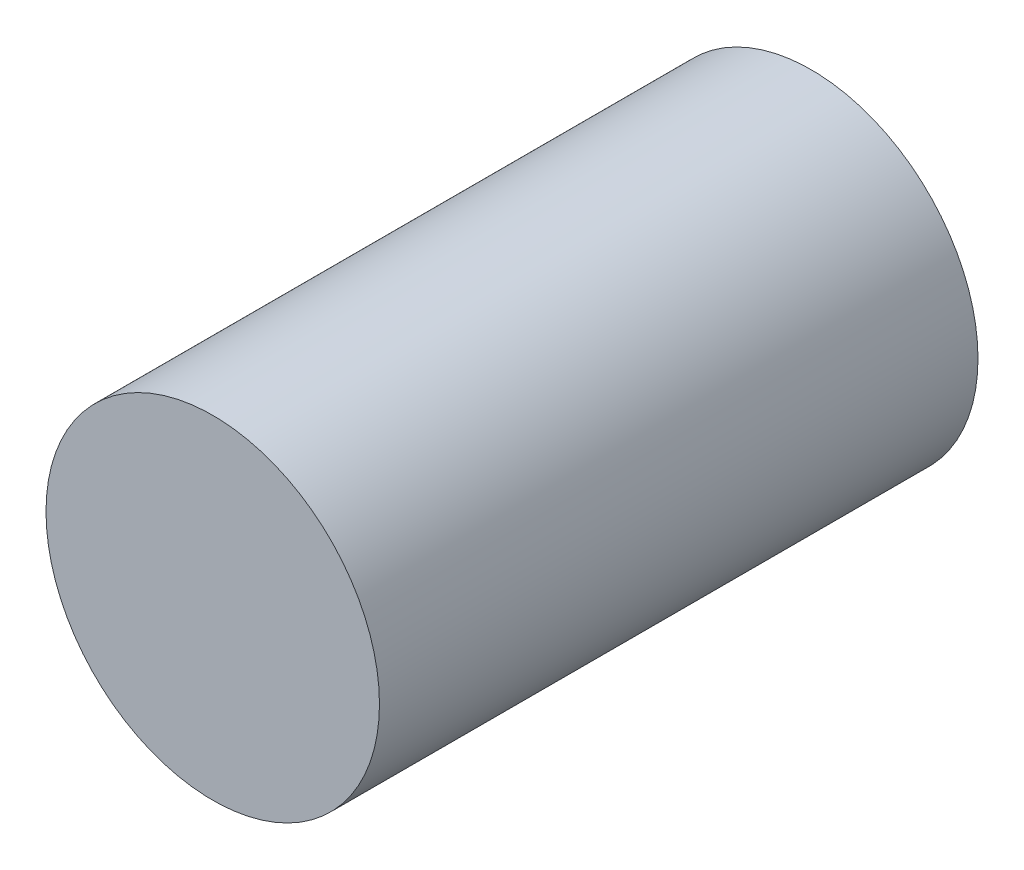
ISO-10303-21;
HEADER;
FILE_DESCRIPTION(('STEP AP214'),'2;1');
FILE_NAME('part.step','',(''),(''),'','','');
FILE_SCHEMA(('AUTOMOTIVE_DESIGN { 1 0 10303 214 1 1 1 1 }'));
ENDSEC;
DATA;
#1=APPLICATION_CONTEXT('core data for automotive mechanical design processes');
#2=APPLICATION_PROTOCOL_DEFINITION('international standard','automotive_design',2000,#1);
#3=PRODUCT_CONTEXT('',#1,'mechanical');
#4=PRODUCT('Part','Part','',(#3));
#5=PRODUCT_RELATED_PRODUCT_CATEGORY('part','',(#4));
#6=PRODUCT_DEFINITION_FORMATION('','',#4);
#7=PRODUCT_DEFINITION_CONTEXT('part definition',#1,'design');
#8=PRODUCT_DEFINITION('design','',#6,#7);
#9=PRODUCT_DEFINITION_SHAPE('','',#8);
#10=(LENGTH_UNIT() NAMED_UNIT(*) SI_UNIT(.MILLI.,.METRE.));
#11=(NAMED_UNIT(*) PLANE_ANGLE_UNIT() SI_UNIT($,.RADIAN.));
#12=(NAMED_UNIT(*) SI_UNIT($,.STERADIAN.) SOLID_ANGLE_UNIT());
#13=UNCERTAINTY_MEASURE_WITH_UNIT(LENGTH_MEASURE(1.E-05),#10,'distance_accuracy_value','');
#14=(GEOMETRIC_REPRESENTATION_CONTEXT(3) GLOBAL_UNCERTAINTY_ASSIGNED_CONTEXT((#13)) GLOBAL_UNIT_ASSIGNED_CONTEXT((#10,
#11,#12)) REPRESENTATION_CONTEXT('',''));
#15=CARTESIAN_POINT('',(0.,0.,0.));
#16=DIRECTION('',(0.,0.,1.));
#17=DIRECTION('',(1.,0.,0.));
#18=AXIS2_PLACEMENT_3D('',#15,#16,#17);
#19=CARTESIAN_POINT('',(0.,0.,70.));
#20=DIRECTION('',(0.,0.,-1.));
#21=DIRECTION('',(-1.,0.,0.));
#22=AXIS2_PLACEMENT_3D('',#19,#20,#21);
#23=PLANE('',#22);
#24=CARTESIAN_POINT('',(0.,0.,70.));
#25=DIRECTION('',(0.,0.,1.));
#26=DIRECTION('',(1.,0.,0.));
#27=AXIS2_PLACEMENT_3D('',#24,#25,#26);
#28=CIRCLE('',#27,19.5);
#29=CARTESIAN_POINT('',(19.5,0.,70.));
#30=VERTEX_POINT('',#29);
#31=EDGE_CURVE('E22',#30,#30,#28,.F.);
#32=ORIENTED_EDGE('',*,*,#31,.F.);
#33=EDGE_LOOP('',(#32));
#34=FACE_BOUND('',#33,.T.);
#35=ADVANCED_FACE('F15',(#34),#23,.F.);
#36=CARTESIAN_POINT('',(0.,0.,0.));
#37=DIRECTION('',(0.,0.,-1.));
#38=DIRECTION('',(-1.,0.,0.));
#39=AXIS2_PLACEMENT_3D('',#36,#37,#38);
#40=PLANE('',#39);
#41=CARTESIAN_POINT('',(0.,0.,0.));
#42=DIRECTION('',(0.,0.,1.));
#43=DIRECTION('',(1.,0.,0.));
#44=AXIS2_PLACEMENT_3D('',#41,#42,#43);
#45=CIRCLE('',#44,19.5);
#46=CARTESIAN_POINT('',(19.5,0.,0.));
#47=VERTEX_POINT('',#46);
#48=EDGE_CURVE('E10',#47,#47,#45,.T.);
#49=ORIENTED_EDGE('',*,*,#48,.F.);
#50=EDGE_LOOP('',(#49));
#51=FACE_BOUND('',#50,.T.);
#52=ADVANCED_FACE('F34',(#51),#40,.T.);
#53=CARTESIAN_POINT('',(0.,0.,0.));
#54=DIRECTION('',(0.,0.,1.));
#55=DIRECTION('',(1.,0.,0.));
#56=AXIS2_PLACEMENT_3D('',#53,#54,#55);
#57=CYLINDRICAL_SURFACE('',#56,19.5);
#58=ORIENTED_EDGE('',*,*,#48,.T.);
#59=EDGE_LOOP('',(#58));
#60=FACE_BOUND('',#59,.T.);
#61=ORIENTED_EDGE('',*,*,#31,.T.);
#62=EDGE_LOOP('',(#61));
#63=FACE_BOUND('',#62,.T.);
#64=ADVANCED_FACE('F31',(#60,#63),#57,.T.);
#65=CLOSED_SHELL('',(#35,#52,#64));
#66=MANIFOLD_SOLID_BREP('B1',#65);
#67=ADVANCED_BREP_SHAPE_REPRESENTATION('',(#18,#66),#14);
#68=SHAPE_DEFINITION_REPRESENTATION(#9,#67);
ENDSEC;
END-ISO-10303-21;
